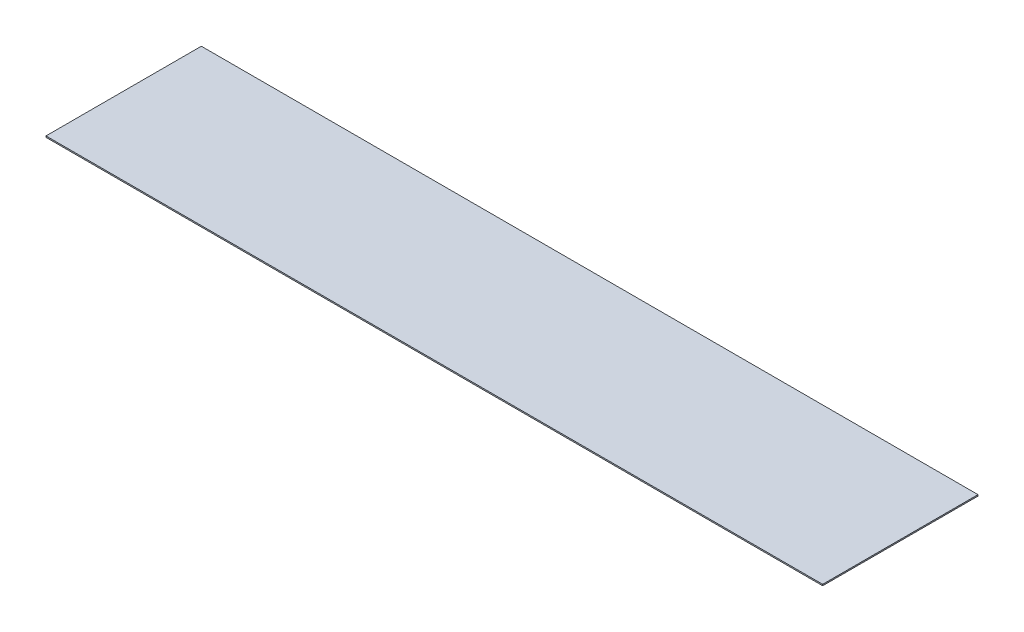
ISO-10303-21;
HEADER;
FILE_DESCRIPTION(('STEP AP214'),'2;1');
FILE_NAME('part.step','',(''),(''),'','','');
FILE_SCHEMA(('AUTOMOTIVE_DESIGN { 1 0 10303 214 1 1 1 1 }'));
ENDSEC;
DATA;
#1=APPLICATION_CONTEXT('core data for automotive mechanical design processes');
#2=APPLICATION_PROTOCOL_DEFINITION('international standard','automotive_design',2000,#1);
#3=PRODUCT_CONTEXT('',#1,'mechanical');
#4=PRODUCT('Part','Part','',(#3));
#5=PRODUCT_RELATED_PRODUCT_CATEGORY('part','',(#4));
#6=PRODUCT_DEFINITION_FORMATION('','',#4);
#7=PRODUCT_DEFINITION_CONTEXT('part definition',#1,'design');
#8=PRODUCT_DEFINITION('design','',#6,#7);
#9=PRODUCT_DEFINITION_SHAPE('','',#8);
#10=(LENGTH_UNIT() NAMED_UNIT(*) SI_UNIT(.MILLI.,.METRE.));
#11=(NAMED_UNIT(*) PLANE_ANGLE_UNIT() SI_UNIT($,.RADIAN.));
#12=(NAMED_UNIT(*) SI_UNIT($,.STERADIAN.) SOLID_ANGLE_UNIT());
#13=UNCERTAINTY_MEASURE_WITH_UNIT(LENGTH_MEASURE(1.E-05),#10,'distance_accuracy_value','');
#14=(GEOMETRIC_REPRESENTATION_CONTEXT(3) GLOBAL_UNCERTAINTY_ASSIGNED_CONTEXT((#13)) GLOBAL_UNIT_ASSIGNED_CONTEXT((#10,
#11,#12)) REPRESENTATION_CONTEXT('',''));
#15=CARTESIAN_POINT('',(0.,0.,0.));
#16=DIRECTION('',(0.,0.,1.));
#17=DIRECTION('',(1.,0.,0.));
#18=AXIS2_PLACEMENT_3D('',#15,#16,#17);
#19=CARTESIAN_POINT('',(3000.,10.,-600.));
#20=DIRECTION('',(-1.,0.,0.));
#21=DIRECTION('',(0.,0.,1.));
#22=AXIS2_PLACEMENT_3D('',#19,#20,#21);
#23=PLANE('',#22);
#24=DIRECTION('',(0.,0.,-1.));
#25=VECTOR('',#24,1.);
#26=CARTESIAN_POINT('',(3000.,0.,-600.));
#27=LINE('',#26,#25);
#28=CARTESIAN_POINT('',(3000.,0.,600.));
#29=VERTEX_POINT('',#28);
#30=CARTESIAN_POINT('',(3000.,0.,-600.));
#31=VERTEX_POINT('',#30);
#32=EDGE_CURVE('E95',#29,#31,#27,.T.);
#33=ORIENTED_EDGE('',*,*,#32,.T.);
#34=DIRECTION('',(0.,-1.,0.));
#35=VECTOR('',#34,1.);
#36=CARTESIAN_POINT('',(3000.,10.,-600.));
#37=LINE('',#36,#35);
#38=CARTESIAN_POINT('',(3000.,10.,-600.));
#39=VERTEX_POINT('',#38);
#40=EDGE_CURVE('E11',#39,#31,#37,.T.);
#41=ORIENTED_EDGE('',*,*,#40,.F.);
#42=DIRECTION('',(0.,0.,-1.));
#43=VECTOR('',#42,1.);
#44=CARTESIAN_POINT('',(3000.,10.,-600.));
#45=LINE('',#44,#43);
#46=CARTESIAN_POINT('',(3000.,10.,600.));
#47=VERTEX_POINT('',#46);
#48=EDGE_CURVE('E83',#47,#39,#45,.T.);
#49=ORIENTED_EDGE('',*,*,#48,.F.);
#50=DIRECTION('',(0.,-1.,0.));
#51=VECTOR('',#50,1.);
#52=CARTESIAN_POINT('',(3000.,10.,600.));
#53=LINE('',#52,#51);
#54=EDGE_CURVE('E91',#47,#29,#53,.T.);
#55=ORIENTED_EDGE('',*,*,#54,.T.);
#56=EDGE_LOOP('',(#33,#41,#49,#55));
#57=FACE_BOUND('',#56,.T.);
#58=ADVANCED_FACE('F32',(#57),#23,.F.);
#59=CARTESIAN_POINT('',(-3000.,10.,-600.));
#60=DIRECTION('',(0.,0.,1.));
#61=DIRECTION('',(1.,0.,0.));
#62=AXIS2_PLACEMENT_3D('',#59,#60,#61);
#63=PLANE('',#62);
#64=DIRECTION('',(-1.,0.,0.));
#65=VECTOR('',#64,1.);
#66=CARTESIAN_POINT('',(-3000.,0.,-600.));
#67=LINE('',#66,#65);
#68=CARTESIAN_POINT('',(-3000.,0.,-600.));
#69=VERTEX_POINT('',#68);
#70=EDGE_CURVE('E87',#31,#69,#67,.T.);
#71=ORIENTED_EDGE('',*,*,#70,.T.);
#72=DIRECTION('',(0.,-1.,0.));
#73=VECTOR('',#72,1.);
#74=CARTESIAN_POINT('',(-3000.,10.,-600.));
#75=LINE('',#74,#73);
#76=CARTESIAN_POINT('',(-3000.,10.,-600.));
#77=VERTEX_POINT('',#76);
#78=EDGE_CURVE('E40',#77,#69,#75,.T.);
#79=ORIENTED_EDGE('',*,*,#78,.F.);
#80=DIRECTION('',(-1.,0.,0.));
#81=VECTOR('',#80,1.);
#82=CARTESIAN_POINT('',(-3000.,10.,-600.));
#83=LINE('',#82,#81);
#84=EDGE_CURVE('E78',#39,#77,#83,.T.);
#85=ORIENTED_EDGE('',*,*,#84,.F.);
#86=ORIENTED_EDGE('',*,*,#40,.T.);
#87=EDGE_LOOP('',(#71,#79,#85,#86));
#88=FACE_BOUND('',#87,.T.);
#89=ADVANCED_FACE('F86',(#88),#63,.F.);
#90=CARTESIAN_POINT('',(-3000.,10.,-600.));
#91=DIRECTION('',(1.,0.,0.));
#92=DIRECTION('',(0.,0.,-1.));
#93=AXIS2_PLACEMENT_3D('',#90,#91,#92);
#94=PLANE('',#93);
#95=DIRECTION('',(0.,0.,1.));
#96=VECTOR('',#95,1.);
#97=CARTESIAN_POINT('',(-3000.,0.,-600.));
#98=LINE('',#97,#96);
#99=CARTESIAN_POINT('',(-3000.,0.,600.));
#100=VERTEX_POINT('',#99);
#101=EDGE_CURVE('E65',#69,#100,#98,.T.);
#102=ORIENTED_EDGE('',*,*,#101,.T.);
#103=DIRECTION('',(0.,-1.,0.));
#104=VECTOR('',#103,1.);
#105=CARTESIAN_POINT('',(-3000.,10.,600.));
#106=LINE('',#105,#104);
#107=CARTESIAN_POINT('',(-3000.,10.,600.));
#108=VERTEX_POINT('',#107);
#109=EDGE_CURVE('E88',#108,#100,#106,.T.);
#110=ORIENTED_EDGE('',*,*,#109,.F.);
#111=DIRECTION('',(0.,0.,1.));
#112=VECTOR('',#111,1.);
#113=CARTESIAN_POINT('',(-3000.,10.,-600.));
#114=LINE('',#113,#112);
#115=EDGE_CURVE('E81',#77,#108,#114,.T.);
#116=ORIENTED_EDGE('',*,*,#115,.F.);
#117=ORIENTED_EDGE('',*,*,#78,.T.);
#118=EDGE_LOOP('',(#102,#110,#116,#117));
#119=FACE_BOUND('',#118,.T.);
#120=ADVANCED_FACE('F89',(#119),#94,.F.);
#121=CARTESIAN_POINT('',(-3000.,10.,600.));
#122=DIRECTION('',(0.,0.,-1.));
#123=DIRECTION('',(-1.,0.,0.));
#124=AXIS2_PLACEMENT_3D('',#121,#122,#123);
#125=PLANE('',#124);
#126=DIRECTION('',(1.,0.,0.));
#127=VECTOR('',#126,1.);
#128=CARTESIAN_POINT('',(-3000.,0.,600.));
#129=LINE('',#128,#127);
#130=EDGE_CURVE('E71',#100,#29,#129,.T.);
#131=ORIENTED_EDGE('',*,*,#130,.T.);
#132=ORIENTED_EDGE('',*,*,#54,.F.);
#133=DIRECTION('',(1.,0.,0.));
#134=VECTOR('',#133,1.);
#135=CARTESIAN_POINT('',(-3000.,10.,600.));
#136=LINE('',#135,#134);
#137=EDGE_CURVE('E48',#108,#47,#136,.T.);
#138=ORIENTED_EDGE('',*,*,#137,.F.);
#139=ORIENTED_EDGE('',*,*,#109,.T.);
#140=EDGE_LOOP('',(#131,#132,#138,#139));
#141=FACE_BOUND('',#140,.T.);
#142=ADVANCED_FACE('F102',(#141),#125,.F.);
#143=CARTESIAN_POINT('',(0.,10.,0.));
#144=DIRECTION('',(0.,1.,0.));
#145=DIRECTION('',(0.,0.,1.));
#146=AXIS2_PLACEMENT_3D('',#143,#144,#145);
#147=PLANE('',#146);
#148=ORIENTED_EDGE('',*,*,#48,.T.);
#149=ORIENTED_EDGE('',*,*,#84,.T.);
#150=ORIENTED_EDGE('',*,*,#115,.T.);
#151=ORIENTED_EDGE('',*,*,#137,.T.);
#152=EDGE_LOOP('',(#148,#149,#150,#151));
#153=FACE_BOUND('',#152,.T.);
#154=ADVANCED_FACE('F79',(#153),#147,.T.);
#155=CARTESIAN_POINT('',(0.,0.,0.));
#156=DIRECTION('',(0.,1.,0.));
#157=DIRECTION('',(0.,0.,1.));
#158=AXIS2_PLACEMENT_3D('',#155,#156,#157);
#159=PLANE('',#158);
#160=ORIENTED_EDGE('',*,*,#32,.F.);
#161=ORIENTED_EDGE('',*,*,#130,.F.);
#162=ORIENTED_EDGE('',*,*,#101,.F.);
#163=ORIENTED_EDGE('',*,*,#70,.F.);
#164=EDGE_LOOP('',(#160,#161,#162,#163));
#165=FACE_BOUND('',#164,.T.);
#166=ADVANCED_FACE('F105',(#165),#159,.F.);
#167=CLOSED_SHELL('',(#58,#89,#120,#142,#154,#166));
#168=MANIFOLD_SOLID_BREP('B2',#167);
#169=ADVANCED_BREP_SHAPE_REPRESENTATION('',(#18,#168),#14);
#170=SHAPE_DEFINITION_REPRESENTATION(#9,#169);
ENDSEC;
END-ISO-10303-21;
